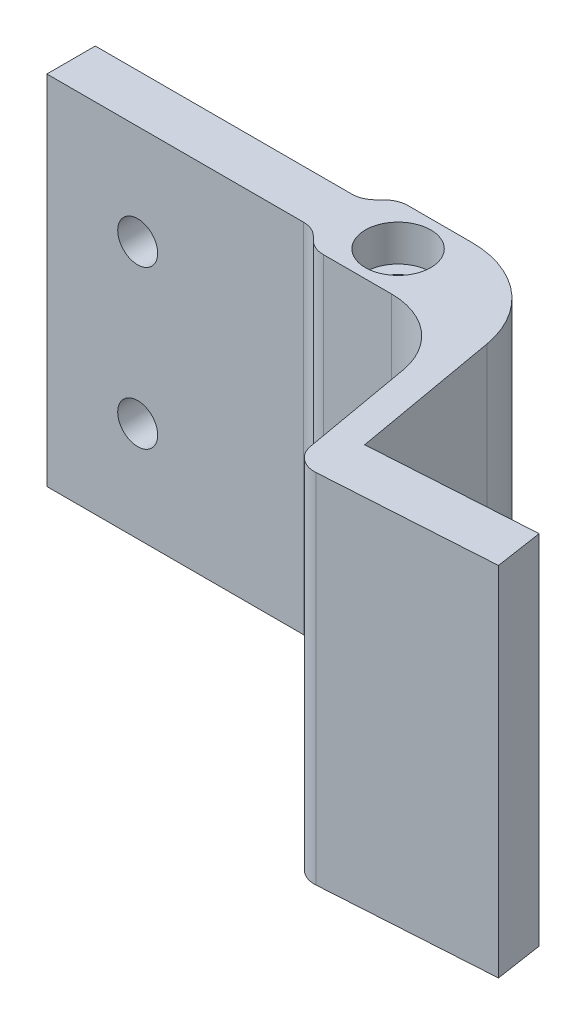
ISO-10303-21;
HEADER;
FILE_DESCRIPTION(('STEP AP214'),'2;1');
FILE_NAME('part.step','',(''),(''),'','','');
FILE_SCHEMA(('AUTOMOTIVE_DESIGN { 1 0 10303 214 1 1 1 1 }'));
ENDSEC;
DATA;
#1=APPLICATION_CONTEXT('core data for automotive mechanical design processes');
#2=APPLICATION_PROTOCOL_DEFINITION('international standard','automotive_design',2000,#1);
#3=PRODUCT_CONTEXT('',#1,'mechanical');
#4=PRODUCT('Part','Part','',(#3));
#5=PRODUCT_RELATED_PRODUCT_CATEGORY('part','',(#4));
#6=PRODUCT_DEFINITION_FORMATION('','',#4);
#7=PRODUCT_DEFINITION_CONTEXT('part definition',#1,'design');
#8=PRODUCT_DEFINITION('design','',#6,#7);
#9=PRODUCT_DEFINITION_SHAPE('','',#8);
#10=(LENGTH_UNIT() NAMED_UNIT(*) SI_UNIT(.MILLI.,.METRE.));
#11=(NAMED_UNIT(*) PLANE_ANGLE_UNIT() SI_UNIT($,.RADIAN.));
#12=(NAMED_UNIT(*) SI_UNIT($,.STERADIAN.) SOLID_ANGLE_UNIT());
#13=UNCERTAINTY_MEASURE_WITH_UNIT(LENGTH_MEASURE(1.E-05),#10,'distance_accuracy_value','');
#14=(GEOMETRIC_REPRESENTATION_CONTEXT(3) GLOBAL_UNCERTAINTY_ASSIGNED_CONTEXT((#13)) GLOBAL_UNIT_ASSIGNED_CONTEXT((#10,
#11,#12)) REPRESENTATION_CONTEXT('',''));
#15=CARTESIAN_POINT('',(0.,0.,0.));
#16=DIRECTION('',(0.,0.,1.));
#17=DIRECTION('',(1.,0.,0.));
#18=AXIS2_PLACEMENT_3D('',#15,#16,#17);
#19=CARTESIAN_POINT('',(21.1715728752538,29.5,2.));
#20=DIRECTION('',(0.,1.,0.));
#21=DIRECTION('',(0.,0.,1.));
#22=AXIS2_PLACEMENT_3D('',#19,#20,#21);
#23=CYLINDRICAL_SURFACE('',#22,2.);
#24=DIRECTION('',(0.,-1.,0.));
#25=VECTOR('',#24,1.);
#26=CARTESIAN_POINT('',(22.5857864376269,29.5,0.5857864376269));
#27=LINE('',#26,#25);
#28=CARTESIAN_POINT('',(22.5857864376269,29.5,0.5857864376269));
#29=VERTEX_POINT('',#28);
#30=CARTESIAN_POINT('',(22.5857864376269,0.,0.5857864376269));
#31=VERTEX_POINT('',#30);
#32=EDGE_CURVE('E269',#29,#31,#27,.T.);
#33=ORIENTED_EDGE('',*,*,#32,.F.);
#34=CARTESIAN_POINT('',(21.1715728752538,29.5,2.));
#35=DIRECTION('',(0.,-1.,0.));
#36=DIRECTION('',(0.,0.,-1.));
#37=AXIS2_PLACEMENT_3D('',#34,#35,#36);
#38=CIRCLE('',#37,2.);
#39=CARTESIAN_POINT('',(21.1715728752538,29.5,0.));
#40=VERTEX_POINT('',#39);
#41=EDGE_CURVE('E42',#29,#40,#38,.F.);
#42=ORIENTED_EDGE('',*,*,#41,.T.);
#43=DIRECTION('',(0.,-1.,0.));
#44=VECTOR('',#43,1.);
#45=CARTESIAN_POINT('',(21.1715728752538,29.5,0.));
#46=LINE('',#45,#44);
#47=CARTESIAN_POINT('',(21.1715728752538,0.,0.));
#48=VERTEX_POINT('',#47);
#49=EDGE_CURVE('E172',#48,#40,#46,.F.);
#50=ORIENTED_EDGE('',*,*,#49,.F.);
#51=CARTESIAN_POINT('',(21.1715728752538,0.,2.));
#52=DIRECTION('',(0.,-1.,0.));
#53=DIRECTION('',(0.,0.,-1.));
#54=AXIS2_PLACEMENT_3D('',#51,#52,#53);
#55=CIRCLE('',#54,2.);
#56=EDGE_CURVE('E12',#48,#31,#55,.T.);
#57=ORIENTED_EDGE('',*,*,#56,.T.);
#58=EDGE_LOOP('',(#33,#42,#50,#57));
#59=FACE_BOUND('',#58,.T.);
#60=ADVANCED_FACE('F35',(#59),#23,.F.);
#61=CARTESIAN_POINT('',(24.3284271247462,29.5,-0.5));
#62=DIRECTION('',(0.,-1.,0.));
#63=DIRECTION('',(0.,0.,-1.));
#64=AXIS2_PLACEMENT_3D('',#61,#62,#63);
#65=CYLINDRICAL_SURFACE('',#64,2.);
#66=DIRECTION('',(0.,-1.,0.));
#67=VECTOR('',#66,1.);
#68=CARTESIAN_POINT('',(24.3284271247462,29.5,1.5));
#69=LINE('',#68,#67);
#70=CARTESIAN_POINT('',(24.3284271247462,29.5,1.5));
#71=VERTEX_POINT('',#70);
#72=CARTESIAN_POINT('',(24.3284271247462,0.,1.5));
#73=VERTEX_POINT('',#72);
#74=EDGE_CURVE('E258',#71,#73,#69,.T.);
#75=ORIENTED_EDGE('',*,*,#74,.F.);
#76=CARTESIAN_POINT('',(24.3284271247462,29.5,-0.5));
#77=DIRECTION('',(0.,-1.,0.));
#78=DIRECTION('',(0.,0.,-1.));
#79=AXIS2_PLACEMENT_3D('',#76,#77,#78);
#80=CIRCLE('',#79,2.);
#81=CARTESIAN_POINT('',(22.9142135623731,29.5,0.9142135623731));
#82=VERTEX_POINT('',#81);
#83=EDGE_CURVE('E264',#82,#71,#80,.F.);
#84=ORIENTED_EDGE('',*,*,#83,.F.);
#85=DIRECTION('',(0.,-1.,0.));
#86=VECTOR('',#85,1.);
#87=CARTESIAN_POINT('',(22.9142135623731,29.5,0.9142135623731));
#88=LINE('',#87,#86);
#89=CARTESIAN_POINT('',(22.9142135623731,0.,0.9142135623731));
#90=VERTEX_POINT('',#89);
#91=EDGE_CURVE('E261',#90,#82,#88,.F.);
#92=ORIENTED_EDGE('',*,*,#91,.F.);
#93=CARTESIAN_POINT('',(24.3284271247462,0.,-0.5));
#94=DIRECTION('',(0.,-1.,0.));
#95=DIRECTION('',(0.,0.,-1.));
#96=AXIS2_PLACEMENT_3D('',#93,#94,#95);
#97=CIRCLE('',#96,2.);
#98=EDGE_CURVE('E266',#73,#90,#97,.T.);
#99=ORIENTED_EDGE('',*,*,#98,.F.);
#100=EDGE_LOOP('',(#75,#84,#92,#99));
#101=FACE_BOUND('',#100,.T.);
#102=ADVANCED_FACE('F404',(#101),#65,.T.);
#103=CARTESIAN_POINT('',(21.1715728752538,29.5,-6.));
#104=DIRECTION('',(0.,-1.,0.));
#105=DIRECTION('',(0.,0.,-1.));
#106=AXIS2_PLACEMENT_3D('',#103,#104,#105);
#107=CYLINDRICAL_SURFACE('',#106,2.);
#108=DIRECTION('',(0.,1.,0.));
#109=VECTOR('',#108,1.);
#110=CARTESIAN_POINT('',(22.5857864376269,29.5,-4.58578643762691));
#111=LINE('',#110,#109);
#112=CARTESIAN_POINT('',(22.5857864376269,0.,-4.58578643762691));
#113=VERTEX_POINT('',#112);
#114=CARTESIAN_POINT('',(22.5857864376269,29.5,-4.58578643762691));
#115=VERTEX_POINT('',#114);
#116=EDGE_CURVE('E248',#113,#115,#111,.T.);
#117=ORIENTED_EDGE('',*,*,#116,.F.);
#118=CARTESIAN_POINT('',(21.1715728752538,0.,-6.));
#119=DIRECTION('',(0.,-1.,0.));
#120=DIRECTION('',(0.,0.,-1.));
#121=AXIS2_PLACEMENT_3D('',#118,#119,#120);
#122=CIRCLE('',#121,2.);
#123=CARTESIAN_POINT('',(21.1715728752538,0.,-4.));
#124=VERTEX_POINT('',#123);
#125=EDGE_CURVE('E254',#113,#124,#122,.T.);
#126=ORIENTED_EDGE('',*,*,#125,.T.);
#127=DIRECTION('',(0.,1.,0.));
#128=VECTOR('',#127,1.);
#129=CARTESIAN_POINT('',(21.1715728752538,29.5,-4.));
#130=LINE('',#129,#128);
#131=CARTESIAN_POINT('',(21.1715728752538,29.5,-4.));
#132=VERTEX_POINT('',#131);
#133=EDGE_CURVE('E251',#132,#124,#130,.F.);
#134=ORIENTED_EDGE('',*,*,#133,.F.);
#135=CARTESIAN_POINT('',(21.1715728752538,29.5,-6.));
#136=DIRECTION('',(0.,-1.,0.));
#137=DIRECTION('',(0.,0.,-1.));
#138=AXIS2_PLACEMENT_3D('',#135,#136,#137);
#139=CIRCLE('',#138,2.);
#140=EDGE_CURVE('E256',#132,#115,#139,.F.);
#141=ORIENTED_EDGE('',*,*,#140,.T.);
#142=EDGE_LOOP('',(#117,#126,#134,#141));
#143=FACE_BOUND('',#142,.T.);
#144=ADVANCED_FACE('F367',(#143),#107,.F.);
#145=CARTESIAN_POINT('',(24.3284271247462,29.5,-3.5));
#146=DIRECTION('',(0.,1.,0.));
#147=DIRECTION('',(0.,0.,1.));
#148=AXIS2_PLACEMENT_3D('',#145,#146,#147);
#149=CYLINDRICAL_SURFACE('',#148,2.);
#150=DIRECTION('',(0.,1.,0.));
#151=VECTOR('',#150,1.);
#152=CARTESIAN_POINT('',(24.3284271247462,29.5,-5.5));
#153=LINE('',#152,#151);
#154=CARTESIAN_POINT('',(24.3284271247462,0.,-5.5));
#155=VERTEX_POINT('',#154);
#156=CARTESIAN_POINT('',(24.3284271247462,29.5,-5.5));
#157=VERTEX_POINT('',#156);
#158=EDGE_CURVE('E238',#155,#157,#153,.T.);
#159=ORIENTED_EDGE('',*,*,#158,.F.);
#160=CARTESIAN_POINT('',(24.3284271247462,0.,-3.5));
#161=DIRECTION('',(0.,-1.,0.));
#162=DIRECTION('',(0.,0.,-1.));
#163=AXIS2_PLACEMENT_3D('',#160,#161,#162);
#164=CIRCLE('',#163,2.);
#165=CARTESIAN_POINT('',(22.9142135623731,0.,-4.91421356237309));
#166=VERTEX_POINT('',#165);
#167=EDGE_CURVE('E244',#166,#155,#164,.T.);
#168=ORIENTED_EDGE('',*,*,#167,.F.);
#169=DIRECTION('',(0.,1.,0.));
#170=VECTOR('',#169,1.);
#171=CARTESIAN_POINT('',(22.9142135623731,29.5,-4.91421356237309));
#172=LINE('',#171,#170);
#173=CARTESIAN_POINT('',(22.9142135623731,29.5,-4.91421356237309));
#174=VERTEX_POINT('',#173);
#175=EDGE_CURVE('E241',#174,#166,#172,.F.);
#176=ORIENTED_EDGE('',*,*,#175,.F.);
#177=CARTESIAN_POINT('',(24.3284271247462,29.5,-3.5));
#178=DIRECTION('',(0.,-1.,0.));
#179=DIRECTION('',(0.,0.,-1.));
#180=AXIS2_PLACEMENT_3D('',#177,#178,#179);
#181=CIRCLE('',#180,2.);
#182=EDGE_CURVE('E246',#157,#174,#181,.F.);
#183=ORIENTED_EDGE('',*,*,#182,.F.);
#184=EDGE_LOOP('',(#159,#168,#176,#183));
#185=FACE_BOUND('',#184,.T.);
#186=ADVANCED_FACE('F373',(#185),#149,.T.);
#187=CARTESIAN_POINT('',(39.4804193620971,29.5,15.3921799062375));
#188=DIRECTION('',(0.,1.,0.));
#189=DIRECTION('',(0.,0.,1.));
#190=AXIS2_PLACEMENT_3D('',#187,#188,#189);
#191=CYLINDRICAL_SURFACE('',#190,2.);
#192=DIRECTION('',(0.,1.,0.));
#193=VECTOR('',#192,1.);
#194=CARTESIAN_POINT('',(37.5108038560727,29.5,15.7394762615714));
#195=LINE('',#194,#193);
#196=CARTESIAN_POINT('',(37.5108038560727,0.,15.7394762615714));
#197=VERTEX_POINT('',#196);
#198=CARTESIAN_POINT('',(37.5108038560727,29.5,15.7394762615714));
#199=VERTEX_POINT('',#198);
#200=EDGE_CURVE('E228',#197,#199,#195,.T.);
#201=ORIENTED_EDGE('',*,*,#200,.F.);
#202=CARTESIAN_POINT('',(39.4804193620971,0.,15.3921799062375));
#203=DIRECTION('',(0.,-1.,0.));
#204=DIRECTION('',(0.,0.,-1.));
#205=AXIS2_PLACEMENT_3D('',#202,#203,#204);
#206=CIRCLE('',#205,2.);
#207=CARTESIAN_POINT('',(39.6054193620971,0.,17.3882698340714));
#208=VERTEX_POINT('',#207);
#209=EDGE_CURVE('E234',#208,#197,#206,.T.);
#210=ORIENTED_EDGE('',*,*,#209,.F.);
#211=DIRECTION('',(0.,1.,0.));
#212=VECTOR('',#211,1.);
#213=CARTESIAN_POINT('',(39.6054193620971,29.5,17.3882698340714));
#214=LINE('',#213,#212);
#215=CARTESIAN_POINT('',(39.6054193620971,29.5,17.3882698340714));
#216=VERTEX_POINT('',#215);
#217=EDGE_CURVE('E231',#216,#208,#214,.F.);
#218=ORIENTED_EDGE('',*,*,#217,.F.);
#219=CARTESIAN_POINT('',(39.4804193620971,29.5,15.3921799062375));
#220=DIRECTION('',(0.,-1.,0.));
#221=DIRECTION('',(0.,0.,-1.));
#222=AXIS2_PLACEMENT_3D('',#219,#220,#221);
#223=CIRCLE('',#222,2.);
#224=EDGE_CURVE('E236',#199,#216,#223,.F.);
#225=ORIENTED_EDGE('',*,*,#224,.F.);
#226=EDGE_LOOP('',(#201,#210,#218,#225));
#227=FACE_BOUND('',#226,.T.);
#228=ADVANCED_FACE('F390',(#227),#191,.T.);
#229=CARTESIAN_POINT('',(29.9654022129363,29.5,7.5));
#230=DIRECTION('',(0.,-1.,0.));
#231=DIRECTION('',(0.,0.,-1.));
#232=AXIS2_PLACEMENT_3D('',#229,#230,#231);
#233=CYLINDRICAL_SURFACE('',#232,6.);
#234=DIRECTION('',(0.,1.,0.));
#235=VECTOR('',#234,1.);
#236=CARTESIAN_POINT('',(29.9654022129363,29.5,1.5));
#237=LINE('',#236,#235);
#238=CARTESIAN_POINT('',(29.9654022129363,0.,1.5));
#239=VERTEX_POINT('',#238);
#240=CARTESIAN_POINT('',(29.9654022129363,29.5,1.5));
#241=VERTEX_POINT('',#240);
#242=EDGE_CURVE('E217',#239,#241,#237,.T.);
#243=ORIENTED_EDGE('',*,*,#242,.F.);
#244=CARTESIAN_POINT('',(29.9654022129363,0.,7.5));
#245=DIRECTION('',(0.,-1.,0.));
#246=DIRECTION('',(0.,0.,-1.));
#247=AXIS2_PLACEMENT_3D('',#244,#245,#246);
#248=CIRCLE('',#247,6.);
#249=CARTESIAN_POINT('',(35.8742487310096,0.,6.45811093399844));
#250=VERTEX_POINT('',#249);
#251=EDGE_CURVE('E223',#239,#250,#248,.T.);
#252=ORIENTED_EDGE('',*,*,#251,.T.);
#253=DIRECTION('',(0.,1.,0.));
#254=VECTOR('',#253,1.);
#255=CARTESIAN_POINT('',(35.8742487310096,29.5,6.45811093399844));
#256=LINE('',#255,#254);
#257=CARTESIAN_POINT('',(35.8742487310096,29.5,6.45811093399844));
#258=VERTEX_POINT('',#257);
#259=EDGE_CURVE('E220',#258,#250,#256,.F.);
#260=ORIENTED_EDGE('',*,*,#259,.F.);
#261=CARTESIAN_POINT('',(29.9654022129363,29.5,7.5));
#262=DIRECTION('',(0.,-1.,0.));
#263=DIRECTION('',(0.,0.,-1.));
#264=AXIS2_PLACEMENT_3D('',#261,#262,#263);
#265=CIRCLE('',#264,6.);
#266=EDGE_CURVE('E225',#258,#241,#265,.F.);
#267=ORIENTED_EDGE('',*,*,#266,.T.);
#268=EDGE_LOOP('',(#243,#252,#260,#267));
#269=FACE_BOUND('',#268,.T.);
#270=ADVANCED_FACE('F397',(#269),#233,.F.);
#271=CARTESIAN_POINT('',(29.5914806153369,29.5,2.5));
#272=DIRECTION('',(0.,-1.,0.));
#273=DIRECTION('',(0.,0.,-1.));
#274=AXIS2_PLACEMENT_3D('',#271,#272,#273);
#275=CYLINDRICAL_SURFACE('',#274,8.);
#276=DIRECTION('',(0.,-1.,0.));
#277=VECTOR('',#276,1.);
#278=CARTESIAN_POINT('',(29.5914806153369,29.5,-5.5));
#279=LINE('',#278,#277);
#280=CARTESIAN_POINT('',(29.5914806153369,29.5,-5.5));
#281=VERTEX_POINT('',#280);
#282=CARTESIAN_POINT('',(29.5914806153369,0.,-5.5));
#283=VERTEX_POINT('',#282);
#284=EDGE_CURVE('E190',#281,#283,#279,.T.);
#285=ORIENTED_EDGE('',*,*,#284,.F.);
#286=CARTESIAN_POINT('',(29.5914806153369,29.5,2.5));
#287=DIRECTION('',(0.,-1.,0.));
#288=DIRECTION('',(0.,0.,-1.));
#289=AXIS2_PLACEMENT_3D('',#286,#287,#288);
#290=CIRCLE('',#289,8.);
#291=CARTESIAN_POINT('',(37.4699426394345,29.5,1.11081457866458));
#292=VERTEX_POINT('',#291);
#293=EDGE_CURVE('E213',#292,#281,#290,.F.);
#294=ORIENTED_EDGE('',*,*,#293,.F.);
#295=DIRECTION('',(0.,-1.,0.));
#296=VECTOR('',#295,1.);
#297=CARTESIAN_POINT('',(37.4699426394345,29.5,1.11081457866458));
#298=LINE('',#297,#296);
#299=CARTESIAN_POINT('',(37.4699426394345,0.,1.11081457866458));
#300=VERTEX_POINT('',#299);
#301=EDGE_CURVE('E194',#300,#292,#298,.F.);
#302=ORIENTED_EDGE('',*,*,#301,.F.);
#303=CARTESIAN_POINT('',(29.5914806153369,0.,2.5));
#304=DIRECTION('',(0.,-1.,0.));
#305=DIRECTION('',(0.,0.,-1.));
#306=AXIS2_PLACEMENT_3D('',#303,#304,#305);
#307=CIRCLE('',#306,8.);
#308=EDGE_CURVE('E215',#283,#300,#307,.T.);
#309=ORIENTED_EDGE('',*,*,#308,.F.);
#310=EDGE_LOOP('',(#285,#294,#302,#309));
#311=FACE_BOUND('',#310,.T.);
#312=ADVANCED_FACE('F379',(#311),#275,.T.);
#313=CARTESIAN_POINT('',(27.,29.5,-2.));
#314=DIRECTION('',(0.,-1.,0.));
#315=DIRECTION('',(0.,0.,-1.));
#316=AXIS2_PLACEMENT_3D('',#313,#314,#315);
#317=CYLINDRICAL_SURFACE('',#316,1.65);
#318=CARTESIAN_POINT('',(27.,26.5,-2.));
#319=DIRECTION('',(0.,1.,0.));
#320=DIRECTION('',(0.,0.,1.));
#321=AXIS2_PLACEMENT_3D('',#318,#319,#320);
#322=CIRCLE('',#321,1.65);
#323=CARTESIAN_POINT('',(27.,26.5,-0.350000000000001));
#324=VERTEX_POINT('',#323);
#325=EDGE_CURVE('E201',#324,#324,#322,.T.);
#326=ORIENTED_EDGE('',*,*,#325,.T.);
#327=EDGE_LOOP('',(#326));
#328=FACE_BOUND('',#327,.T.);
#329=CARTESIAN_POINT('',(27.,3.,-2.));
#330=DIRECTION('',(0.,-1.,0.));
#331=DIRECTION('',(0.,0.,-1.));
#332=AXIS2_PLACEMENT_3D('',#329,#330,#331);
#333=CIRCLE('',#332,1.65);
#334=CARTESIAN_POINT('',(27.,3.,-3.65));
#335=VERTEX_POINT('',#334);
#336=EDGE_CURVE('E206',#335,#335,#333,.T.);
#337=ORIENTED_EDGE('',*,*,#336,.T.);
#338=EDGE_LOOP('',(#337));
#339=FACE_BOUND('',#338,.T.);
#340=ADVANCED_FACE('F420',(#328,#339),#317,.F.);
#341=CARTESIAN_POINT('',(0.,29.5,0.));
#342=DIRECTION('',(0.,-1.,0.));
#343=DIRECTION('',(0.,0.,-1.));
#344=AXIS2_PLACEMENT_3D('',#341,#342,#343);
#345=PLANE('',#344);
#346=ORIENTED_EDGE('',*,*,#41,.F.);
#347=DIRECTION('',(0.70710678118655,0.,0.707106781186545));
#348=VECTOR('',#347,1.);
#349=CARTESIAN_POINT('',(22.,29.5,0.));
#350=LINE('',#349,#348);
#351=EDGE_CURVE('E174',#29,#82,#350,.T.);
#352=ORIENTED_EDGE('',*,*,#351,.T.);
#353=ORIENTED_EDGE('',*,*,#83,.T.);
#354=DIRECTION('',(1.,0.,0.));
#355=VECTOR('',#354,1.);
#356=CARTESIAN_POINT('',(23.5,29.5,1.5));
#357=LINE('',#356,#355);
#358=EDGE_CURVE('E341',#71,#241,#357,.T.);
#359=ORIENTED_EDGE('',*,*,#358,.T.);
#360=ORIENTED_EDGE('',*,*,#266,.F.);
#361=DIRECTION('',(0.173648177666927,0.,0.984807753012209));
#362=VECTOR('',#361,1.);
#363=CARTESIAN_POINT('',(37.8212316913354,29.5,17.5));
#364=LINE('',#363,#362);
#365=EDGE_CURVE('E343',#258,#199,#364,.T.);
#366=ORIENTED_EDGE('',*,*,#365,.T.);
#367=ORIENTED_EDGE('',*,*,#224,.T.);
#368=DIRECTION('',(0.998044963916957,0.,-0.0624999999999999));
#369=VECTOR('',#368,1.);
#370=CARTESIAN_POINT('',(53.7899511140067,29.5,16.5));
#371=LINE('',#370,#369);
#372=CARTESIAN_POINT('',(53.7899511140067,29.5,16.5));
#373=VERTEX_POINT('',#372);
#374=EDGE_CURVE('E346',#216,#373,#371,.T.);
#375=ORIENTED_EDGE('',*,*,#374,.T.);
#376=DIRECTION('',(-0.149247518756473,0.,-0.988799867589512));
#377=VECTOR('',#376,1.);
#378=CARTESIAN_POINT('',(53.1929610389808,29.5,12.544800529642));
#379=LINE('',#378,#377);
#380=CARTESIAN_POINT('',(53.1929610389808,29.5,12.544800529642));
#381=VERTEX_POINT('',#380);
#382=EDGE_CURVE('E348',#373,#381,#379,.T.);
#383=ORIENTED_EDGE('',*,*,#382,.T.);
#384=DIRECTION('',(-0.998044963916957,0.,0.0624999999999997));
#385=VECTOR('',#384,1.);
#386=CARTESIAN_POINT('',(39.635761777212,29.5,13.3937852793221));
#387=LINE('',#386,#385);
#388=CARTESIAN_POINT('',(39.635761777212,29.5,13.3937852793221));
#389=VERTEX_POINT('',#388);
#390=EDGE_CURVE('E320',#381,#389,#387,.T.);
#391=ORIENTED_EDGE('',*,*,#390,.T.);
#392=DIRECTION('',(-0.173648177666927,0.,-0.984807753012209));
#393=VECTOR('',#392,1.);
#394=CARTESIAN_POINT('',(36.3042776647551,29.5,-5.5));
#395=LINE('',#394,#393);
#396=EDGE_CURVE('E351',#389,#292,#395,.T.);
#397=ORIENTED_EDGE('',*,*,#396,.T.);
#398=ORIENTED_EDGE('',*,*,#293,.T.);
#399=DIRECTION('',(-1.,0.,0.));
#400=VECTOR('',#399,1.);
#401=CARTESIAN_POINT('',(30.5,29.5,-5.5));
#402=LINE('',#401,#400);
#403=EDGE_CURVE('E353',#281,#157,#402,.T.);
#404=ORIENTED_EDGE('',*,*,#403,.T.);
#405=ORIENTED_EDGE('',*,*,#182,.T.);
#406=DIRECTION('',(-0.707106781186546,0.,0.707106781186549));
#407=VECTOR('',#406,1.);
#408=CARTESIAN_POINT('',(22.,29.5,-4.));
#409=LINE('',#408,#407);
#410=EDGE_CURVE('E356',#174,#115,#409,.T.);
#411=ORIENTED_EDGE('',*,*,#410,.T.);
#412=ORIENTED_EDGE('',*,*,#140,.F.);
#413=DIRECTION('',(-1.,0.,0.));
#414=VECTOR('',#413,1.);
#415=CARTESIAN_POINT('',(0.,29.5,-4.));
#416=LINE('',#415,#414);
#417=CARTESIAN_POINT('',(0.,29.5,-4.));
#418=VERTEX_POINT('',#417);
#419=EDGE_CURVE('E181',#132,#418,#416,.T.);
#420=ORIENTED_EDGE('',*,*,#419,.T.);
#421=DIRECTION('',(0.,0.,1.));
#422=VECTOR('',#421,1.);
#423=CARTESIAN_POINT('',(0.,29.5,0.));
#424=LINE('',#423,#422);
#425=CARTESIAN_POINT('',(0.,29.5,0.));
#426=VERTEX_POINT('',#425);
#427=EDGE_CURVE('E175',#418,#426,#424,.T.);
#428=ORIENTED_EDGE('',*,*,#427,.T.);
#429=DIRECTION('',(1.,0.,0.));
#430=VECTOR('',#429,1.);
#431=CARTESIAN_POINT('',(22.,29.5,0.));
#432=LINE('',#431,#430);
#433=EDGE_CURVE('E165',#426,#40,#432,.T.);
#434=ORIENTED_EDGE('',*,*,#433,.T.);
#435=EDGE_LOOP('',(#346,#352,#353,#359,#360,#366,#367,#375,#383,#391,#397,#398,#404,#405,#411,
#412,#420,#428,#434));
#436=FACE_BOUND('',#435,.T.);
#437=CARTESIAN_POINT('',(27.,29.5,-2.));
#438=DIRECTION('',(0.,1.,0.));
#439=DIRECTION('',(0.,0.,1.));
#440=AXIS2_PLACEMENT_3D('',#437,#438,#439);
#441=CIRCLE('',#440,2.7);
#442=CARTESIAN_POINT('',(27.,29.5,0.700000000000001));
#443=VERTEX_POINT('',#442);
#444=EDGE_CURVE('E208',#443,#443,#441,.T.);
#445=ORIENTED_EDGE('',*,*,#444,.F.);
#446=EDGE_LOOP('',(#445));
#447=FACE_BOUND('',#446,.T.);
#448=ADVANCED_FACE('F178',(#436,#447),#345,.F.);
#449=CARTESIAN_POINT('',(0.,0.,0.));
#450=DIRECTION('',(0.,-1.,0.));
#451=DIRECTION('',(0.,0.,-1.));
#452=AXIS2_PLACEMENT_3D('',#449,#450,#451);
#453=PLANE('',#452);
#454=CARTESIAN_POINT('',(27.,0.,-2.));
#455=DIRECTION('',(0.,-1.,0.));
#456=DIRECTION('',(0.,0.,-1.));
#457=AXIS2_PLACEMENT_3D('',#454,#455,#456);
#458=CIRCLE('',#457,2.7);
#459=CARTESIAN_POINT('',(27.,0.,-4.7));
#460=VERTEX_POINT('',#459);
#461=EDGE_CURVE('E504',#460,#460,#458,.T.);
#462=ORIENTED_EDGE('',*,*,#461,.F.);
#463=EDGE_LOOP('',(#462));
#464=FACE_BOUND('',#463,.T.);
#465=DIRECTION('',(1.,0.,0.));
#466=VECTOR('',#465,1.);
#467=CARTESIAN_POINT('',(23.5,0.,1.5));
#468=LINE('',#467,#466);
#469=EDGE_CURVE('E279',#73,#239,#468,.T.);
#470=ORIENTED_EDGE('',*,*,#469,.F.);
#471=ORIENTED_EDGE('',*,*,#98,.T.);
#472=DIRECTION('',(0.70710678118655,0.,0.707106781186545));
#473=VECTOR('',#472,1.);
#474=CARTESIAN_POINT('',(22.,0.,0.));
#475=LINE('',#474,#473);
#476=EDGE_CURVE('E275',#31,#90,#475,.T.);
#477=ORIENTED_EDGE('',*,*,#476,.F.);
#478=ORIENTED_EDGE('',*,*,#56,.F.);
#479=DIRECTION('',(1.,0.,0.));
#480=VECTOR('',#479,1.);
#481=CARTESIAN_POINT('',(22.,0.,0.));
#482=LINE('',#481,#480);
#483=CARTESIAN_POINT('',(0.,0.,0.));
#484=VERTEX_POINT('',#483);
#485=EDGE_CURVE('E280',#484,#48,#482,.T.);
#486=ORIENTED_EDGE('',*,*,#485,.F.);
#487=DIRECTION('',(0.,0.,1.));
#488=VECTOR('',#487,1.);
#489=CARTESIAN_POINT('',(0.,0.,0.));
#490=LINE('',#489,#488);
#491=CARTESIAN_POINT('',(0.,0.,-4.));
#492=VERTEX_POINT('',#491);
#493=EDGE_CURVE('E189',#492,#484,#490,.T.);
#494=ORIENTED_EDGE('',*,*,#493,.F.);
#495=DIRECTION('',(-1.,0.,0.));
#496=VECTOR('',#495,1.);
#497=CARTESIAN_POINT('',(0.,0.,-4.));
#498=LINE('',#497,#496);
#499=EDGE_CURVE('E185',#124,#492,#498,.T.);
#500=ORIENTED_EDGE('',*,*,#499,.F.);
#501=ORIENTED_EDGE('',*,*,#125,.F.);
#502=DIRECTION('',(-0.707106781186546,0.,0.707106781186549));
#503=VECTOR('',#502,1.);
#504=CARTESIAN_POINT('',(22.,0.,-4.));
#505=LINE('',#504,#503);
#506=EDGE_CURVE('E302',#166,#113,#505,.T.);
#507=ORIENTED_EDGE('',*,*,#506,.F.);
#508=ORIENTED_EDGE('',*,*,#167,.T.);
#509=DIRECTION('',(-1.,0.,0.));
#510=VECTOR('',#509,1.);
#511=CARTESIAN_POINT('',(23.5,0.,-5.5));
#512=LINE('',#511,#510);
#513=EDGE_CURVE('E299',#283,#155,#512,.T.);
#514=ORIENTED_EDGE('',*,*,#513,.F.);
#515=ORIENTED_EDGE('',*,*,#308,.T.);
#516=DIRECTION('',(-0.173648177666927,0.,-0.984807753012209));
#517=VECTOR('',#516,1.);
#518=CARTESIAN_POINT('',(36.3042776647551,0.,-5.5));
#519=LINE('',#518,#517);
#520=CARTESIAN_POINT('',(39.635761777212,0.,13.3937852793221));
#521=VERTEX_POINT('',#520);
#522=EDGE_CURVE('E296',#521,#300,#519,.T.);
#523=ORIENTED_EDGE('',*,*,#522,.F.);
#524=DIRECTION('',(-0.998044963916957,0.,0.0624999999999997));
#525=VECTOR('',#524,1.);
#526=CARTESIAN_POINT('',(39.635761777212,0.,13.3937852793221));
#527=LINE('',#526,#525);
#528=CARTESIAN_POINT('',(53.1929610389808,0.,12.544800529642));
#529=VERTEX_POINT('',#528);
#530=EDGE_CURVE('E293',#529,#521,#527,.T.);
#531=ORIENTED_EDGE('',*,*,#530,.F.);
#532=DIRECTION('',(-0.149247518756473,0.,-0.988799867589512));
#533=VECTOR('',#532,1.);
#534=CARTESIAN_POINT('',(53.1929610389808,0.,12.544800529642));
#535=LINE('',#534,#533);
#536=CARTESIAN_POINT('',(53.7899511140067,0.,16.5));
#537=VERTEX_POINT('',#536);
#538=EDGE_CURVE('E291',#537,#529,#535,.T.);
#539=ORIENTED_EDGE('',*,*,#538,.F.);
#540=DIRECTION('',(0.998044963916957,0.,-0.0624999999999999));
#541=VECTOR('',#540,1.);
#542=CARTESIAN_POINT('',(53.7899511140067,0.,16.5));
#543=LINE('',#542,#541);
#544=EDGE_CURVE('E289',#208,#537,#543,.T.);
#545=ORIENTED_EDGE('',*,*,#544,.F.);
#546=ORIENTED_EDGE('',*,*,#209,.T.);
#547=DIRECTION('',(0.173648177666927,0.,0.984807753012209));
#548=VECTOR('',#547,1.);
#549=CARTESIAN_POINT('',(37.8212316913354,0.,17.5));
#550=LINE('',#549,#548);
#551=EDGE_CURVE('E282',#250,#197,#550,.T.);
#552=ORIENTED_EDGE('',*,*,#551,.F.);
#553=ORIENTED_EDGE('',*,*,#251,.F.);
#554=EDGE_LOOP('',(#470,#471,#477,#478,#486,#494,#500,#501,#507,#508,#514,#515,#523,#531,#539,
#545,#546,#552,#553));
#555=FACE_BOUND('',#554,.T.);
#556=ADVANCED_FACE('F277',(#464,#555),#453,.T.);
#557=CARTESIAN_POINT('',(0.,29.5,0.));
#558=DIRECTION('',(1.,0.,0.));
#559=DIRECTION('',(0.,0.,-1.));
#560=AXIS2_PLACEMENT_3D('',#557,#558,#559);
#561=PLANE('',#560);
#562=ORIENTED_EDGE('',*,*,#493,.T.);
#563=DIRECTION('',(0.,-1.,0.));
#564=VECTOR('',#563,1.);
#565=CARTESIAN_POINT('',(0.,29.5,0.));
#566=LINE('',#565,#564);
#567=EDGE_CURVE('E170',#426,#484,#566,.T.);
#568=ORIENTED_EDGE('',*,*,#567,.F.);
#569=ORIENTED_EDGE('',*,*,#427,.F.);
#570=DIRECTION('',(0.,-1.,0.));
#571=VECTOR('',#570,1.);
#572=CARTESIAN_POINT('',(0.,29.5,-4.));
#573=LINE('',#572,#571);
#574=EDGE_CURVE('E306',#418,#492,#573,.T.);
#575=ORIENTED_EDGE('',*,*,#574,.T.);
#576=EDGE_LOOP('',(#562,#568,#569,#575));
#577=FACE_BOUND('',#576,.T.);
#578=ADVANCED_FACE('F187',(#577),#561,.F.);
#579=CARTESIAN_POINT('',(22.,29.5,0.));
#580=DIRECTION('',(0.,0.,-1.));
#581=DIRECTION('',(-1.,0.,0.));
#582=AXIS2_PLACEMENT_3D('',#579,#580,#581);
#583=PLANE('',#582);
#584=CARTESIAN_POINT('',(7.5,21.25,0.));
#585=DIRECTION('',(0.,0.,-1.));
#586=DIRECTION('',(-1.,0.,0.));
#587=AXIS2_PLACEMENT_3D('',#584,#585,#586);
#588=CIRCLE('',#587,1.65);
#589=CARTESIAN_POINT('',(5.85,21.25,0.));
#590=VERTEX_POINT('',#589);
#591=EDGE_CURVE('E491',#590,#590,#588,.F.);
#592=ORIENTED_EDGE('',*,*,#591,.F.);
#593=EDGE_LOOP('',(#592));
#594=FACE_BOUND('',#593,.T.);
#595=CARTESIAN_POINT('',(7.5,8.25,0.));
#596=DIRECTION('',(0.,0.,-1.));
#597=DIRECTION('',(-1.,0.,0.));
#598=AXIS2_PLACEMENT_3D('',#595,#596,#597);
#599=CIRCLE('',#598,1.65);
#600=CARTESIAN_POINT('',(5.85,8.25,0.));
#601=VERTEX_POINT('',#600);
#602=EDGE_CURVE('E501',#601,#601,#599,.F.);
#603=ORIENTED_EDGE('',*,*,#602,.F.);
#604=EDGE_LOOP('',(#603));
#605=FACE_BOUND('',#604,.T.);
#606=ORIENTED_EDGE('',*,*,#485,.T.);
#607=ORIENTED_EDGE('',*,*,#49,.T.);
#608=ORIENTED_EDGE('',*,*,#433,.F.);
#609=ORIENTED_EDGE('',*,*,#567,.T.);
#610=EDGE_LOOP('',(#606,#607,#608,#609));
#611=FACE_BOUND('',#610,.T.);
#612=ADVANCED_FACE('F168',(#594,#605,#611),#583,.F.);
#613=CARTESIAN_POINT('',(22.,29.5,0.));
#614=DIRECTION('',(0.707106781186545,0.,-0.70710678118655));
#615=DIRECTION('',(-0.70710678118655,0.,-0.707106781186545));
#616=AXIS2_PLACEMENT_3D('',#613,#614,#615);
#617=PLANE('',#616);
#618=ORIENTED_EDGE('',*,*,#351,.F.);
#619=ORIENTED_EDGE('',*,*,#32,.T.);
#620=ORIENTED_EDGE('',*,*,#476,.T.);
#621=ORIENTED_EDGE('',*,*,#91,.T.);
#622=EDGE_LOOP('',(#618,#619,#620,#621));
#623=FACE_BOUND('',#622,.T.);
#624=ADVANCED_FACE('F274',(#623),#617,.F.);
#625=CARTESIAN_POINT('',(23.5,29.5,1.5));
#626=DIRECTION('',(0.,0.,-1.));
#627=DIRECTION('',(-1.,0.,0.));
#628=AXIS2_PLACEMENT_3D('',#625,#626,#627);
#629=PLANE('',#628);
#630=ORIENTED_EDGE('',*,*,#358,.F.);
#631=ORIENTED_EDGE('',*,*,#74,.T.);
#632=ORIENTED_EDGE('',*,*,#469,.T.);
#633=ORIENTED_EDGE('',*,*,#242,.T.);
#634=EDGE_LOOP('',(#630,#631,#632,#633));
#635=FACE_BOUND('',#634,.T.);
#636=ADVANCED_FACE('F400',(#635),#629,.F.);
#637=CARTESIAN_POINT('',(37.8212316913354,29.5,17.5));
#638=DIRECTION('',(0.984807753012209,0.,-0.173648177666927));
#639=DIRECTION('',(-0.173648177666927,0.,-0.984807753012209));
#640=AXIS2_PLACEMENT_3D('',#637,#638,#639);
#641=PLANE('',#640);
#642=ORIENTED_EDGE('',*,*,#551,.T.);
#643=ORIENTED_EDGE('',*,*,#200,.T.);
#644=ORIENTED_EDGE('',*,*,#365,.F.);
#645=ORIENTED_EDGE('',*,*,#259,.T.);
#646=EDGE_LOOP('',(#642,#643,#644,#645));
#647=FACE_BOUND('',#646,.T.);
#648=ADVANCED_FACE('F393',(#647),#641,.F.);
#649=CARTESIAN_POINT('',(53.7899511140067,29.5,16.5));
#650=DIRECTION('',(-0.0624999999999999,0.,-0.998044963916957));
#651=DIRECTION('',(-0.998044963916957,0.,0.0624999999999999));
#652=AXIS2_PLACEMENT_3D('',#649,#650,#651);
#653=PLANE('',#652);
#654=ORIENTED_EDGE('',*,*,#374,.F.);
#655=ORIENTED_EDGE('',*,*,#217,.T.);
#656=ORIENTED_EDGE('',*,*,#544,.T.);
#657=DIRECTION('',(0.,-1.,0.));
#658=VECTOR('',#657,1.);
#659=CARTESIAN_POINT('',(53.7899511140067,29.5,16.5));
#660=LINE('',#659,#658);
#661=EDGE_CURVE('E191',#373,#537,#660,.T.);
#662=ORIENTED_EDGE('',*,*,#661,.F.);
#663=EDGE_LOOP('',(#654,#655,#656,#662));
#664=FACE_BOUND('',#663,.T.);
#665=ADVANCED_FACE('F384',(#664),#653,.F.);
#666=CARTESIAN_POINT('',(53.1929610389808,29.5,12.544800529642));
#667=DIRECTION('',(-0.988799867589512,0.,0.149247518756473));
#668=DIRECTION('',(0.149247518756473,0.,0.988799867589512));
#669=AXIS2_PLACEMENT_3D('',#666,#667,#668);
#670=PLANE('',#669);
#671=ORIENTED_EDGE('',*,*,#538,.T.);
#672=DIRECTION('',(0.,-1.,0.));
#673=VECTOR('',#672,1.);
#674=CARTESIAN_POINT('',(53.1929610389808,29.5,12.544800529642));
#675=LINE('',#674,#673);
#676=EDGE_CURVE('E197',#381,#529,#675,.T.);
#677=ORIENTED_EDGE('',*,*,#676,.F.);
#678=ORIENTED_EDGE('',*,*,#382,.F.);
#679=ORIENTED_EDGE('',*,*,#661,.T.);
#680=EDGE_LOOP('',(#671,#677,#678,#679));
#681=FACE_BOUND('',#680,.T.);
#682=ADVANCED_FACE('F382',(#681),#670,.F.);
#683=CARTESIAN_POINT('',(39.635761777212,29.5,13.3937852793221));
#684=DIRECTION('',(0.0624999999999997,0.,0.998044963916957));
#685=DIRECTION('',(0.998044963916957,0.,-0.0624999999999997));
#686=AXIS2_PLACEMENT_3D('',#683,#684,#685);
#687=PLANE('',#686);
#688=DIRECTION('',(0.,-1.,0.));
#689=VECTOR('',#688,1.);
#690=CARTESIAN_POINT('',(39.635761777212,29.5,13.3937852793221));
#691=LINE('',#690,#689);
#692=CARTESIAN_POINT('',(39.635761777212,14.75,13.3937852793221));
#693=VERTEX_POINT('',#692);
#694=EDGE_CURVE('E308',#693,#521,#691,.T.);
#695=ORIENTED_EDGE('',*,*,#694,.F.);
#696=CARTESIAN_POINT('',(45.873542801693,14.75,13.0031602793221));
#697=DIRECTION('',(-0.0624999999999997,0.,-0.998044963916957));
#698=DIRECTION('',(-0.998044963916957,0.,0.0624999999999997));
#699=AXIS2_PLACEMENT_3D('',#696,#697,#698);
#700=CIRCLE('',#699,6.25000000000001);
#701=EDGE_CURVE('E204',#693,#693,#700,.T.);
#702=ORIENTED_EDGE('',*,*,#701,.F.);
#703=EDGE_CURVE('E309',#389,#693,#691,.T.);
#704=ORIENTED_EDGE('',*,*,#703,.F.);
#705=ORIENTED_EDGE('',*,*,#390,.F.);
#706=ORIENTED_EDGE('',*,*,#676,.T.);
#707=ORIENTED_EDGE('',*,*,#530,.T.);
#708=EDGE_LOOP('',(#695,#702,#704,#705,#706,#707));
#709=FACE_BOUND('',#708,.T.);
#710=ADVANCED_FACE('F317',(#709),#687,.F.);
#711=CARTESIAN_POINT('',(36.3042776647551,29.5,-5.5));
#712=DIRECTION('',(-0.984807753012209,0.,0.173648177666927));
#713=DIRECTION('',(0.173648177666927,0.,0.984807753012209));
#714=AXIS2_PLACEMENT_3D('',#711,#712,#713);
#715=PLANE('',#714);
#716=ORIENTED_EDGE('',*,*,#522,.T.);
#717=ORIENTED_EDGE('',*,*,#301,.T.);
#718=ORIENTED_EDGE('',*,*,#396,.F.);
#719=ORIENTED_EDGE('',*,*,#703,.T.);
#720=ORIENTED_EDGE('',*,*,#694,.T.);
#721=EDGE_LOOP('',(#716,#717,#718,#719,#720));
#722=FACE_BOUND('',#721,.T.);
#723=ADVANCED_FACE('F328',(#722),#715,.F.);
#724=CARTESIAN_POINT('',(23.5,29.5,-5.5));
#725=DIRECTION('',(0.,0.,1.));
#726=DIRECTION('',(1.,0.,0.));
#727=AXIS2_PLACEMENT_3D('',#724,#725,#726);
#728=PLANE('',#727);
#729=ORIENTED_EDGE('',*,*,#513,.T.);
#730=ORIENTED_EDGE('',*,*,#158,.T.);
#731=ORIENTED_EDGE('',*,*,#403,.F.);
#732=ORIENTED_EDGE('',*,*,#284,.T.);
#733=EDGE_LOOP('',(#729,#730,#731,#732));
#734=FACE_BOUND('',#733,.T.);
#735=ADVANCED_FACE('F376',(#734),#728,.F.);
#736=CARTESIAN_POINT('',(22.,29.5,-4.));
#737=DIRECTION('',(0.707106781186549,0.,0.707106781186546));
#738=DIRECTION('',(0.707106781186546,0.,-0.707106781186549));
#739=AXIS2_PLACEMENT_3D('',#736,#737,#738);
#740=PLANE('',#739);
#741=ORIENTED_EDGE('',*,*,#506,.T.);
#742=ORIENTED_EDGE('',*,*,#116,.T.);
#743=ORIENTED_EDGE('',*,*,#410,.F.);
#744=ORIENTED_EDGE('',*,*,#175,.T.);
#745=EDGE_LOOP('',(#741,#742,#743,#744));
#746=FACE_BOUND('',#745,.T.);
#747=ADVANCED_FACE('F363',(#746),#740,.F.);
#748=CARTESIAN_POINT('',(0.,29.5,-4.));
#749=DIRECTION('',(0.,0.,1.));
#750=DIRECTION('',(1.,0.,0.));
#751=AXIS2_PLACEMENT_3D('',#748,#749,#750);
#752=PLANE('',#751);
#753=CARTESIAN_POINT('',(7.5,21.25,-4.));
#754=DIRECTION('',(0.,0.,-1.));
#755=DIRECTION('',(-1.,0.,0.));
#756=AXIS2_PLACEMENT_3D('',#753,#754,#755);
#757=CIRCLE('',#756,1.65);
#758=CARTESIAN_POINT('',(5.85,21.25,-4.));
#759=VERTEX_POINT('',#758);
#760=EDGE_CURVE('E494',#759,#759,#757,.T.);
#761=ORIENTED_EDGE('',*,*,#760,.F.);
#762=EDGE_LOOP('',(#761));
#763=FACE_BOUND('',#762,.T.);
#764=CARTESIAN_POINT('',(7.5,8.25,-4.));
#765=DIRECTION('',(0.,0.,-1.));
#766=DIRECTION('',(-1.,0.,0.));
#767=AXIS2_PLACEMENT_3D('',#764,#765,#766);
#768=CIRCLE('',#767,1.65);
#769=CARTESIAN_POINT('',(5.85,8.25,-4.));
#770=VERTEX_POINT('',#769);
#771=EDGE_CURVE('E496',#770,#770,#768,.T.);
#772=ORIENTED_EDGE('',*,*,#771,.F.);
#773=EDGE_LOOP('',(#772));
#774=FACE_BOUND('',#773,.T.);
#775=ORIENTED_EDGE('',*,*,#419,.F.);
#776=ORIENTED_EDGE('',*,*,#133,.T.);
#777=ORIENTED_EDGE('',*,*,#499,.T.);
#778=ORIENTED_EDGE('',*,*,#574,.F.);
#779=EDGE_LOOP('',(#775,#776,#777,#778));
#780=FACE_BOUND('',#779,.T.);
#781=ADVANCED_FACE('F370',(#763,#774,#780),#752,.F.);
#782=CARTESIAN_POINT('',(47.2274458218199,14.75,34.6232577332361));
#783=DIRECTION('',(-0.0624999999999997,0.,-0.998044963916957));
#784=DIRECTION('',(-0.998044963916957,0.,0.0624999999999997));
#785=AXIS2_PLACEMENT_3D('',#782,#783,#784);
#786=CYLINDRICAL_SURFACE('',#785,6.25000000000001);
#787=CARTESIAN_POINT('',(46.0757164762159,14.75,16.2316149624293));
#788=DIRECTION('',(-0.0624999999999999,0.,-0.998044963916957));
#789=DIRECTION('',(-0.998044963916957,0.,0.0624999999999999));
#790=AXIS2_PLACEMENT_3D('',#787,#788,#789);
#791=CIRCLE('',#790,6.25000000000001);
#792=CARTESIAN_POINT('',(39.8379354517349,14.75,16.6222399624293));
#793=VERTEX_POINT('',#792);
#794=EDGE_CURVE('E333',#793,#793,#791,.F.);
#795=ORIENTED_EDGE('',*,*,#794,.T.);
#796=EDGE_LOOP('',(#795));
#797=FACE_BOUND('',#796,.T.);
#798=ORIENTED_EDGE('',*,*,#701,.T.);
#799=EDGE_LOOP('',(#798));
#800=FACE_BOUND('',#799,.T.);
#801=ADVANCED_FACE('F446',(#797,#800),#786,.F.);
#802=CARTESIAN_POINT('',(53.7430761140067,29.5,15.7514662770623));
#803=DIRECTION('',(-0.0624999999999999,0.,-0.998044963916957));
#804=DIRECTION('',(-0.998044963916957,0.,0.0624999999999999));
#805=AXIS2_PLACEMENT_3D('',#802,#803,#804);
#806=PLANE('',#805);
#807=ORIENTED_EDGE('',*,*,#794,.F.);
#808=EDGE_LOOP('',(#807));
#809=FACE_BOUND('',#808,.T.);
#810=ADVANCED_FACE('F458',(#809),#806,.T.);
#811=CARTESIAN_POINT('',(27.,26.5,-2.));
#812=DIRECTION('',(0.,1.,0.));
#813=DIRECTION('',(0.,0.,1.));
#814=AXIS2_PLACEMENT_3D('',#811,#812,#813);
#815=CYLINDRICAL_SURFACE('',#814,2.7);
#816=CARTESIAN_POINT('',(27.,26.5,-2.));
#817=DIRECTION('',(0.,1.,0.));
#818=DIRECTION('',(0.,0.,1.));
#819=AXIS2_PLACEMENT_3D('',#816,#817,#818);
#820=CIRCLE('',#819,2.7);
#821=CARTESIAN_POINT('',(27.,26.5,0.700000000000001));
#822=VERTEX_POINT('',#821);
#823=EDGE_CURVE('E205',#822,#822,#820,.T.);
#824=ORIENTED_EDGE('',*,*,#823,.F.);
#825=EDGE_LOOP('',(#824));
#826=FACE_BOUND('',#825,.T.);
#827=ORIENTED_EDGE('',*,*,#444,.T.);
#828=EDGE_LOOP('',(#827));
#829=FACE_BOUND('',#828,.T.);
#830=ADVANCED_FACE('F462',(#826,#829),#815,.F.);
#831=CARTESIAN_POINT('',(27.,26.5,-2.));
#832=DIRECTION('',(0.,1.,0.));
#833=DIRECTION('',(0.,0.,1.));
#834=AXIS2_PLACEMENT_3D('',#831,#832,#833);
#835=PLANE('',#834);
#836=ORIENTED_EDGE('',*,*,#325,.F.);
#837=EDGE_LOOP('',(#836));
#838=FACE_BOUND('',#837,.T.);
#839=ORIENTED_EDGE('',*,*,#823,.T.);
#840=EDGE_LOOP('',(#839));
#841=FACE_BOUND('',#840,.T.);
#842=ADVANCED_FACE('F466',(#838,#841),#835,.T.);
#843=CARTESIAN_POINT('',(27.,3.,-2.));
#844=DIRECTION('',(0.,-1.,0.));
#845=DIRECTION('',(0.,0.,-1.));
#846=AXIS2_PLACEMENT_3D('',#843,#844,#845);
#847=CYLINDRICAL_SURFACE('',#846,2.7);
#848=CARTESIAN_POINT('',(27.,3.,-2.));
#849=DIRECTION('',(0.,-1.,0.));
#850=DIRECTION('',(0.,0.,-1.));
#851=AXIS2_PLACEMENT_3D('',#848,#849,#850);
#852=CIRCLE('',#851,2.7);
#853=CARTESIAN_POINT('',(27.,3.,-4.7));
#854=VERTEX_POINT('',#853);
#855=EDGE_CURVE('E209',#854,#854,#852,.T.);
#856=ORIENTED_EDGE('',*,*,#855,.F.);
#857=EDGE_LOOP('',(#856));
#858=FACE_BOUND('',#857,.T.);
#859=ORIENTED_EDGE('',*,*,#461,.T.);
#860=EDGE_LOOP('',(#859));
#861=FACE_BOUND('',#860,.T.);
#862=ADVANCED_FACE('F470',(#858,#861),#847,.F.);
#863=CARTESIAN_POINT('',(27.,3.,-2.));
#864=DIRECTION('',(0.,-1.,0.));
#865=DIRECTION('',(0.,0.,-1.));
#866=AXIS2_PLACEMENT_3D('',#863,#864,#865);
#867=PLANE('',#866);
#868=ORIENTED_EDGE('',*,*,#336,.F.);
#869=EDGE_LOOP('',(#868));
#870=FACE_BOUND('',#869,.T.);
#871=ORIENTED_EDGE('',*,*,#855,.T.);
#872=EDGE_LOOP('',(#871));
#873=FACE_BOUND('',#872,.T.);
#874=ADVANCED_FACE('F474',(#870,#873),#867,.T.);
#875=CARTESIAN_POINT('',(7.5,8.25,4.66690475583122));
#876=DIRECTION('',(0.,0.,-1.));
#877=DIRECTION('',(-1.,0.,0.));
#878=AXIS2_PLACEMENT_3D('',#875,#876,#877);
#879=CYLINDRICAL_SURFACE('',#878,1.65);
#880=ORIENTED_EDGE('',*,*,#602,.T.);
#881=EDGE_LOOP('',(#880));
#882=FACE_BOUND('',#881,.T.);
#883=ORIENTED_EDGE('',*,*,#771,.T.);
#884=EDGE_LOOP('',(#883));
#885=FACE_BOUND('',#884,.T.);
#886=ADVANCED_FACE('F478',(#882,#885),#879,.F.);
#887=CARTESIAN_POINT('',(7.5,21.25,4.66690475583122));
#888=DIRECTION('',(0.,0.,-1.));
#889=DIRECTION('',(-1.,0.,0.));
#890=AXIS2_PLACEMENT_3D('',#887,#888,#889);
#891=CYLINDRICAL_SURFACE('',#890,1.65);
#892=ORIENTED_EDGE('',*,*,#591,.T.);
#893=EDGE_LOOP('',(#892));
#894=FACE_BOUND('',#893,.T.);
#895=ORIENTED_EDGE('',*,*,#760,.T.);
#896=EDGE_LOOP('',(#895));
#897=FACE_BOUND('',#896,.T.);
#898=ADVANCED_FACE('F482',(#894,#897),#891,.F.);
#899=CLOSED_SHELL('',(#60,#102,#144,#186,#228,#270,#312,#340,#448,#556,#578,#612,#624,#636,#648,
#665,#682,#710,#723,#735,#747,#781,#801,#810,#830,#842,#862,#874,#886,#898));
#900=MANIFOLD_SOLID_BREP('B2',#899);
#901=ADVANCED_BREP_SHAPE_REPRESENTATION('',(#18,#900),#14);
#902=SHAPE_DEFINITION_REPRESENTATION(#9,#901);
ENDSEC;
END-ISO-10303-21;
